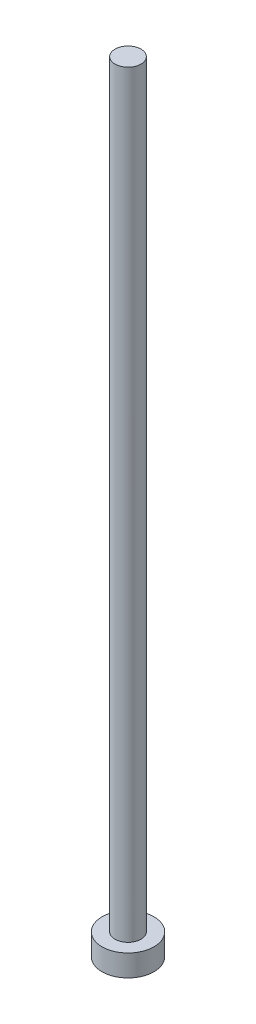
ISO-10303-21;
HEADER;
FILE_DESCRIPTION(('STEP AP214'),'2;1');
FILE_NAME('part.step','',(''),(''),'','','');
FILE_SCHEMA(('AUTOMOTIVE_DESIGN { 1 0 10303 214 1 1 1 1 }'));
ENDSEC;
DATA;
#1=APPLICATION_CONTEXT('core data for automotive mechanical design processes');
#2=APPLICATION_PROTOCOL_DEFINITION('international standard','automotive_design',2000,#1);
#3=PRODUCT_CONTEXT('',#1,'mechanical');
#4=PRODUCT('Part','Part','',(#3));
#5=PRODUCT_RELATED_PRODUCT_CATEGORY('part','',(#4));
#6=PRODUCT_DEFINITION_FORMATION('','',#4);
#7=PRODUCT_DEFINITION_CONTEXT('part definition',#1,'design');
#8=PRODUCT_DEFINITION('design','',#6,#7);
#9=PRODUCT_DEFINITION_SHAPE('','',#8);
#10=(LENGTH_UNIT() NAMED_UNIT(*) SI_UNIT(.MILLI.,.METRE.));
#11=(NAMED_UNIT(*) PLANE_ANGLE_UNIT() SI_UNIT($,.RADIAN.));
#12=(NAMED_UNIT(*) SI_UNIT($,.STERADIAN.) SOLID_ANGLE_UNIT());
#13=UNCERTAINTY_MEASURE_WITH_UNIT(LENGTH_MEASURE(1.E-05),#10,'distance_accuracy_value','');
#14=(GEOMETRIC_REPRESENTATION_CONTEXT(3) GLOBAL_UNCERTAINTY_ASSIGNED_CONTEXT((#13)) GLOBAL_UNIT_ASSIGNED_CONTEXT((#10,
#11,#12)) REPRESENTATION_CONTEXT('',''));
#15=CARTESIAN_POINT('',(0.,0.,0.));
#16=DIRECTION('',(0.,0.,1.));
#17=DIRECTION('',(1.,0.,0.));
#18=AXIS2_PLACEMENT_3D('',#15,#16,#17);
#19=CARTESIAN_POINT('',(0.,175.,0.));
#20=DIRECTION('',(0.,-1.,0.));
#21=DIRECTION('',(0.,0.,-1.));
#22=AXIS2_PLACEMENT_3D('',#19,#20,#21);
#23=CYLINDRICAL_SURFACE('',#22,3.);
#24=CARTESIAN_POINT('',(0.,175.,0.));
#25=DIRECTION('',(0.,1.,0.));
#26=DIRECTION('',(0.,0.,1.));
#27=AXIS2_PLACEMENT_3D('',#24,#25,#26);
#28=CIRCLE('',#27,3.);
#29=CARTESIAN_POINT('',(0.,175.,3.));
#30=VERTEX_POINT('',#29);
#31=EDGE_CURVE('E10',#30,#30,#28,.T.);
#32=ORIENTED_EDGE('',*,*,#31,.F.);
#33=EDGE_LOOP('',(#32));
#34=FACE_BOUND('',#33,.T.);
#35=CARTESIAN_POINT('',(0.,0.,0.));
#36=DIRECTION('',(0.,-1.,0.));
#37=DIRECTION('',(0.,0.,-1.));
#38=AXIS2_PLACEMENT_3D('',#35,#36,#37);
#39=CIRCLE('',#38,3.);
#40=CARTESIAN_POINT('',(0.,0.,-3.));
#41=VERTEX_POINT('',#40);
#42=EDGE_CURVE('E37',#41,#41,#39,.T.);
#43=ORIENTED_EDGE('',*,*,#42,.F.);
#44=EDGE_LOOP('',(#43));
#45=FACE_BOUND('',#44,.T.);
#46=ADVANCED_FACE('F31',(#34,#45),#23,.T.);
#47=CARTESIAN_POINT('',(0.,175.,0.));
#48=DIRECTION('',(0.,1.,0.));
#49=DIRECTION('',(0.,0.,1.));
#50=AXIS2_PLACEMENT_3D('',#47,#48,#49);
#51=PLANE('',#50);
#52=ORIENTED_EDGE('',*,*,#31,.T.);
#53=EDGE_LOOP('',(#52));
#54=FACE_BOUND('',#53,.T.);
#55=ADVANCED_FACE('F64',(#54),#51,.T.);
#56=CARTESIAN_POINT('',(0.,-5.,0.));
#57=DIRECTION('',(0.,1.,0.));
#58=DIRECTION('',(0.,0.,1.));
#59=AXIS2_PLACEMENT_3D('',#56,#57,#58);
#60=CYLINDRICAL_SURFACE('',#59,6.);
#61=CARTESIAN_POINT('',(0.,-5.,0.));
#62=DIRECTION('',(0.,-1.,0.));
#63=DIRECTION('',(0.,0.,-1.));
#64=AXIS2_PLACEMENT_3D('',#61,#62,#63);
#65=CIRCLE('',#64,6.);
#66=CARTESIAN_POINT('',(0.,-5.,-6.));
#67=VERTEX_POINT('',#66);
#68=EDGE_CURVE('E41',#67,#67,#65,.T.);
#69=ORIENTED_EDGE('',*,*,#68,.F.);
#70=EDGE_LOOP('',(#69));
#71=FACE_BOUND('',#70,.T.);
#72=CARTESIAN_POINT('',(0.,0.,0.));
#73=DIRECTION('',(0.,-1.,0.));
#74=DIRECTION('',(0.,0.,-1.));
#75=AXIS2_PLACEMENT_3D('',#72,#73,#74);
#76=CIRCLE('',#75,6.);
#77=CARTESIAN_POINT('',(0.,0.,-6.));
#78=VERTEX_POINT('',#77);
#79=EDGE_CURVE('E45',#78,#78,#76,.T.);
#80=ORIENTED_EDGE('',*,*,#79,.T.);
#81=EDGE_LOOP('',(#80));
#82=FACE_BOUND('',#81,.T.);
#83=ADVANCED_FACE('F51',(#71,#82),#60,.T.);
#84=CARTESIAN_POINT('',(0.,-5.,0.));
#85=DIRECTION('',(0.,-1.,0.));
#86=DIRECTION('',(0.,0.,-1.));
#87=AXIS2_PLACEMENT_3D('',#84,#85,#86);
#88=PLANE('',#87);
#89=ORIENTED_EDGE('',*,*,#68,.T.);
#90=EDGE_LOOP('',(#89));
#91=FACE_BOUND('',#90,.T.);
#92=ADVANCED_FACE('F55',(#91),#88,.T.);
#93=CARTESIAN_POINT('',(0.,0.,0.));
#94=DIRECTION('',(0.,-1.,0.));
#95=DIRECTION('',(0.,0.,-1.));
#96=AXIS2_PLACEMENT_3D('',#93,#94,#95);
#97=PLANE('',#96);
#98=ORIENTED_EDGE('',*,*,#42,.T.);
#99=EDGE_LOOP('',(#98));
#100=FACE_BOUND('',#99,.T.);
#101=ORIENTED_EDGE('',*,*,#79,.F.);
#102=EDGE_LOOP('',(#101));
#103=FACE_BOUND('',#102,.T.);
#104=ADVANCED_FACE('F53',(#100,#103),#97,.F.);
#105=CLOSED_SHELL('',(#46,#55,#83,#92,#104));
#106=MANIFOLD_SOLID_BREP('B2',#105);
#107=ADVANCED_BREP_SHAPE_REPRESENTATION('',(#18,#106),#14);
#108=SHAPE_DEFINITION_REPRESENTATION(#9,#107);
ENDSEC;
END-ISO-10303-21;
